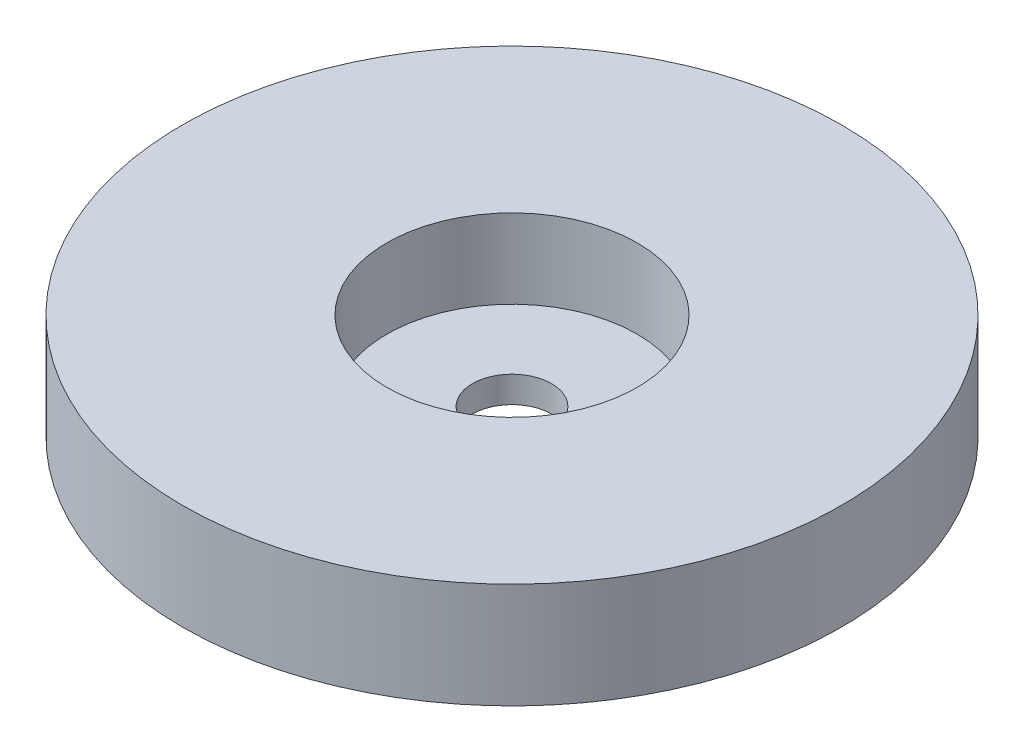
ISO-10303-21;
HEADER;
FILE_DESCRIPTION(('STEP AP214'),'2;1');
FILE_NAME('part.step','',(''),(''),'','','');
FILE_SCHEMA(('AUTOMOTIVE_DESIGN { 1 0 10303 214 1 1 1 1 }'));
ENDSEC;
DATA;
#1=APPLICATION_CONTEXT('core data for automotive mechanical design processes');
#2=APPLICATION_PROTOCOL_DEFINITION('international standard','automotive_design',2000,#1);
#3=PRODUCT_CONTEXT('',#1,'mechanical');
#4=PRODUCT('Part','Part','',(#3));
#5=PRODUCT_RELATED_PRODUCT_CATEGORY('part','',(#4));
#6=PRODUCT_DEFINITION_FORMATION('','',#4);
#7=PRODUCT_DEFINITION_CONTEXT('part definition',#1,'design');
#8=PRODUCT_DEFINITION('design','',#6,#7);
#9=PRODUCT_DEFINITION_SHAPE('','',#8);
#10=(LENGTH_UNIT() NAMED_UNIT(*) SI_UNIT(.MILLI.,.METRE.));
#11=(NAMED_UNIT(*) PLANE_ANGLE_UNIT() SI_UNIT($,.RADIAN.));
#12=(NAMED_UNIT(*) SI_UNIT($,.STERADIAN.) SOLID_ANGLE_UNIT());
#13=UNCERTAINTY_MEASURE_WITH_UNIT(LENGTH_MEASURE(1.E-05),#10,'distance_accuracy_value','');
#14=(GEOMETRIC_REPRESENTATION_CONTEXT(3) GLOBAL_UNCERTAINTY_ASSIGNED_CONTEXT((#13)) GLOBAL_UNIT_ASSIGNED_CONTEXT((#10,
#11,#12)) REPRESENTATION_CONTEXT('',''));
#15=CARTESIAN_POINT('',(0.,0.,0.));
#16=DIRECTION('',(0.,0.,1.));
#17=DIRECTION('',(1.,0.,0.));
#18=AXIS2_PLACEMENT_3D('',#15,#16,#17);
#19=CARTESIAN_POINT('',(0.,8.,0.));
#20=DIRECTION('',(0.,-1.,0.));
#21=DIRECTION('',(0.,0.,-1.));
#22=AXIS2_PLACEMENT_3D('',#19,#20,#21);
#23=CYLINDRICAL_SURFACE('',#22,25.);
#24=CARTESIAN_POINT('',(0.,8.,0.));
#25=DIRECTION('',(0.,1.,0.));
#26=DIRECTION('',(0.,0.,1.));
#27=AXIS2_PLACEMENT_3D('',#24,#25,#26);
#28=CIRCLE('',#27,25.);
#29=CARTESIAN_POINT('',(0.,8.,25.));
#30=VERTEX_POINT('',#29);
#31=EDGE_CURVE('E10',#30,#30,#28,.T.);
#32=ORIENTED_EDGE('',*,*,#31,.F.);
#33=EDGE_LOOP('',(#32));
#34=FACE_BOUND('',#33,.T.);
#35=CARTESIAN_POINT('',(0.,0.,0.));
#36=DIRECTION('',(0.,1.,0.));
#37=DIRECTION('',(0.,0.,1.));
#38=AXIS2_PLACEMENT_3D('',#35,#36,#37);
#39=CIRCLE('',#38,25.);
#40=CARTESIAN_POINT('',(0.,0.,25.));
#41=VERTEX_POINT('',#40);
#42=EDGE_CURVE('E40',#41,#41,#39,.T.);
#43=ORIENTED_EDGE('',*,*,#42,.T.);
#44=EDGE_LOOP('',(#43));
#45=FACE_BOUND('',#44,.T.);
#46=ADVANCED_FACE('F33',(#34,#45),#23,.T.);
#47=CARTESIAN_POINT('',(0.,8.,0.));
#48=DIRECTION('',(0.,1.,0.));
#49=DIRECTION('',(0.,0.,1.));
#50=AXIS2_PLACEMENT_3D('',#47,#48,#49);
#51=PLANE('',#50);
#52=CARTESIAN_POINT('',(0.,8.,0.));
#53=DIRECTION('',(0.,1.,0.));
#54=DIRECTION('',(0.,0.,1.));
#55=AXIS2_PLACEMENT_3D('',#52,#53,#54);
#56=CIRCLE('',#55,9.5);
#57=CARTESIAN_POINT('',(0.,8.,9.5));
#58=VERTEX_POINT('',#57);
#59=EDGE_CURVE('E47',#58,#58,#56,.T.);
#60=ORIENTED_EDGE('',*,*,#59,.F.);
#61=EDGE_LOOP('',(#60));
#62=FACE_BOUND('',#61,.T.);
#63=ORIENTED_EDGE('',*,*,#31,.T.);
#64=EDGE_LOOP('',(#63));
#65=FACE_BOUND('',#64,.T.);
#66=ADVANCED_FACE('F75',(#62,#65),#51,.T.);
#67=CARTESIAN_POINT('',(0.,0.,0.));
#68=DIRECTION('',(0.,1.,0.));
#69=DIRECTION('',(0.,0.,1.));
#70=AXIS2_PLACEMENT_3D('',#67,#68,#69);
#71=PLANE('',#70);
#72=CARTESIAN_POINT('',(0.,0.,0.));
#73=DIRECTION('',(0.,1.,0.));
#74=DIRECTION('',(0.,0.,1.));
#75=AXIS2_PLACEMENT_3D('',#72,#73,#74);
#76=CIRCLE('',#75,3.);
#77=CARTESIAN_POINT('',(0.,0.,3.));
#78=VERTEX_POINT('',#77);
#79=EDGE_CURVE('E50',#78,#78,#76,.T.);
#80=ORIENTED_EDGE('',*,*,#79,.T.);
#81=EDGE_LOOP('',(#80));
#82=FACE_BOUND('',#81,.T.);
#83=ORIENTED_EDGE('',*,*,#42,.F.);
#84=EDGE_LOOP('',(#83));
#85=FACE_BOUND('',#84,.T.);
#86=ADVANCED_FACE('F71',(#82,#85),#71,.F.);
#87=CARTESIAN_POINT('',(0.,2.,0.));
#88=DIRECTION('',(0.,1.,0.));
#89=DIRECTION('',(0.,0.,1.));
#90=AXIS2_PLACEMENT_3D('',#87,#88,#89);
#91=CYLINDRICAL_SURFACE('',#90,9.5);
#92=CARTESIAN_POINT('',(0.,2.,0.));
#93=DIRECTION('',(0.,1.,0.));
#94=DIRECTION('',(0.,0.,1.));
#95=AXIS2_PLACEMENT_3D('',#92,#93,#94);
#96=CIRCLE('',#95,9.5);
#97=CARTESIAN_POINT('',(0.,2.,9.5));
#98=VERTEX_POINT('',#97);
#99=EDGE_CURVE('E45',#98,#98,#96,.T.);
#100=ORIENTED_EDGE('',*,*,#99,.F.);
#101=EDGE_LOOP('',(#100));
#102=FACE_BOUND('',#101,.T.);
#103=ORIENTED_EDGE('',*,*,#59,.T.);
#104=EDGE_LOOP('',(#103));
#105=FACE_BOUND('',#104,.T.);
#106=ADVANCED_FACE('F65',(#102,#105),#91,.F.);
#107=CARTESIAN_POINT('',(0.,2.,0.));
#108=DIRECTION('',(0.,1.,0.));
#109=DIRECTION('',(0.,0.,1.));
#110=AXIS2_PLACEMENT_3D('',#107,#108,#109);
#111=PLANE('',#110);
#112=CARTESIAN_POINT('',(0.,2.,0.));
#113=DIRECTION('',(0.,1.,0.));
#114=DIRECTION('',(0.,0.,1.));
#115=AXIS2_PLACEMENT_3D('',#112,#113,#114);
#116=CIRCLE('',#115,3.);
#117=CARTESIAN_POINT('',(0.,2.,3.));
#118=VERTEX_POINT('',#117);
#119=EDGE_CURVE('E36',#118,#118,#116,.T.);
#120=ORIENTED_EDGE('',*,*,#119,.F.);
#121=EDGE_LOOP('',(#120));
#122=FACE_BOUND('',#121,.T.);
#123=ORIENTED_EDGE('',*,*,#99,.T.);
#124=EDGE_LOOP('',(#123));
#125=FACE_BOUND('',#124,.T.);
#126=ADVANCED_FACE('F62',(#122,#125),#111,.T.);
#127=CARTESIAN_POINT('',(0.,8.,0.));
#128=DIRECTION('',(0.,-1.,0.));
#129=DIRECTION('',(0.,0.,-1.));
#130=AXIS2_PLACEMENT_3D('',#127,#128,#129);
#131=CYLINDRICAL_SURFACE('',#130,3.);
#132=ORIENTED_EDGE('',*,*,#119,.T.);
#133=EDGE_LOOP('',(#132));
#134=FACE_BOUND('',#133,.T.);
#135=ORIENTED_EDGE('',*,*,#79,.F.);
#136=EDGE_LOOP('',(#135));
#137=FACE_BOUND('',#136,.T.);
#138=ADVANCED_FACE('F59',(#134,#137),#131,.F.);
#139=CLOSED_SHELL('',(#46,#66,#86,#106,#126,#138));
#140=MANIFOLD_SOLID_BREP('B2',#139);
#141=ADVANCED_BREP_SHAPE_REPRESENTATION('',(#18,#140),#14);
#142=SHAPE_DEFINITION_REPRESENTATION(#9,#141);
ENDSEC;
END-ISO-10303-21;
